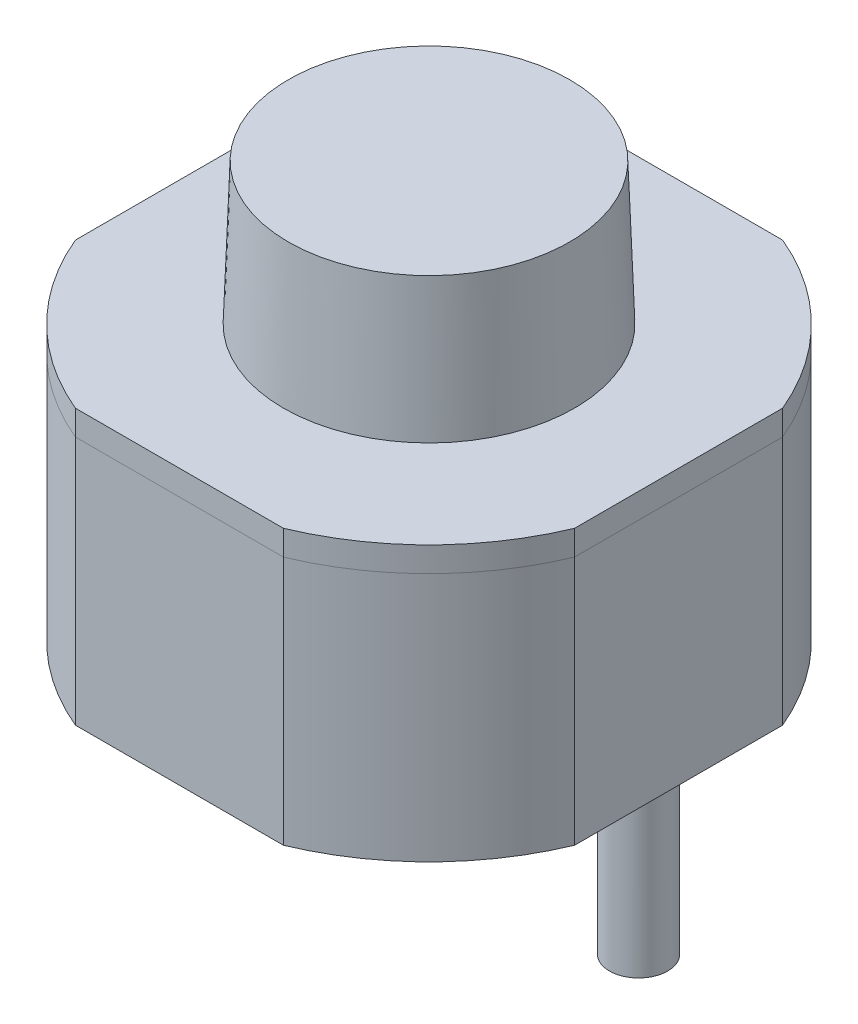
ISO-10303-21;
HEADER;
FILE_DESCRIPTION(('STEP AP214'),'2;1');
FILE_NAME('part.step','',(''),(''),'','','');
FILE_SCHEMA(('AUTOMOTIVE_DESIGN { 1 0 10303 214 1 1 1 1 }'));
ENDSEC;
DATA;
#1=APPLICATION_CONTEXT('core data for automotive mechanical design processes');
#2=APPLICATION_PROTOCOL_DEFINITION('international standard','automotive_design',2000,#1);
#3=PRODUCT_CONTEXT('',#1,'mechanical');
#4=PRODUCT('Part','Part','',(#3));
#5=PRODUCT_RELATED_PRODUCT_CATEGORY('part','',(#4));
#6=PRODUCT_DEFINITION_FORMATION('','',#4);
#7=PRODUCT_DEFINITION_CONTEXT('part definition',#1,'design');
#8=PRODUCT_DEFINITION('design','',#6,#7);
#9=PRODUCT_DEFINITION_SHAPE('','',#8);
#10=(LENGTH_UNIT() NAMED_UNIT(*) SI_UNIT(.MILLI.,.METRE.));
#11=(NAMED_UNIT(*) PLANE_ANGLE_UNIT() SI_UNIT($,.RADIAN.));
#12=(NAMED_UNIT(*) SI_UNIT($,.STERADIAN.) SOLID_ANGLE_UNIT());
#13=UNCERTAINTY_MEASURE_WITH_UNIT(LENGTH_MEASURE(1.E-05),#10,'distance_accuracy_value','');
#14=(GEOMETRIC_REPRESENTATION_CONTEXT(3) GLOBAL_UNCERTAINTY_ASSIGNED_CONTEXT((#13)) GLOBAL_UNIT_ASSIGNED_CONTEXT((#10,
#11,#12)) REPRESENTATION_CONTEXT('',''));
#15=CARTESIAN_POINT('',(0.,0.,0.));
#16=DIRECTION('',(0.,0.,1.));
#17=DIRECTION('',(1.,0.,0.));
#18=AXIS2_PLACEMENT_3D('',#15,#16,#17);
#19=CARTESIAN_POINT('',(0.,3.3,0.));
#20=DIRECTION('',(0.,-1.,0.));
#21=DIRECTION('',(0.,0.,1.));
#22=AXIS2_PLACEMENT_3D('',#19,#20,#21);
#23=CONICAL_SURFACE('',#22,1.75,0.0349065850398866);
#24=CARTESIAN_POINT('',(0.,5.,0.));
#25=DIRECTION('',(0.,1.,0.));
#26=DIRECTION('',(0.,0.,1.));
#27=AXIS2_PLACEMENT_3D('',#24,#25,#26);
#28=CIRCLE('',#27,1.69063469186403);
#29=CARTESIAN_POINT('',(0.,5.,1.69063469186403));
#30=VERTEX_POINT('',#29);
#31=EDGE_CURVE('E12',#30,#30,#28,.T.);
#32=ORIENTED_EDGE('',*,*,#31,.F.);
#33=EDGE_LOOP('',(#32));
#34=FACE_BOUND('',#33,.T.);
#35=CARTESIAN_POINT('',(0.,3.3,0.));
#36=DIRECTION('',(0.,1.,0.));
#37=DIRECTION('',(0.,0.,1.));
#38=AXIS2_PLACEMENT_3D('',#35,#36,#37);
#39=CIRCLE('',#38,1.75);
#40=CARTESIAN_POINT('',(0.,3.3,1.75));
#41=VERTEX_POINT('',#40);
#42=EDGE_CURVE('E66',#41,#41,#39,.T.);
#43=ORIENTED_EDGE('',*,*,#42,.T.);
#44=EDGE_LOOP('',(#43));
#45=FACE_BOUND('',#44,.T.);
#46=ADVANCED_FACE('F59',(#34,#45),#23,.T.);
#47=CARTESIAN_POINT('',(0.,5.,0.));
#48=DIRECTION('',(0.,1.,0.));
#49=DIRECTION('',(0.,0.,1.));
#50=AXIS2_PLACEMENT_3D('',#47,#48,#49);
#51=PLANE('',#50);
#52=ORIENTED_EDGE('',*,*,#31,.T.);
#53=EDGE_LOOP('',(#52));
#54=FACE_BOUND('',#53,.T.);
#55=ADVANCED_FACE('F76',(#54),#51,.T.);
#56=CARTESIAN_POINT('',(0.,3.3,0.));
#57=DIRECTION('',(0.,1.,0.));
#58=DIRECTION('',(0.,0.,1.));
#59=AXIS2_PLACEMENT_3D('',#56,#57,#58);
#60=PLANE('',#59);
#61=ORIENTED_EDGE('',*,*,#42,.F.);
#62=EDGE_LOOP('',(#61));
#63=FACE_BOUND('',#62,.T.);
#64=ADVANCED_FACE('F74',(#63),#60,.F.);
#65=CLOSED_SHELL('',(#46,#55,#64));
#66=MANIFOLD_SOLID_BREP('B2',#65);
#67=CARTESIAN_POINT('',(0.,3.3,0.));
#68=DIRECTION('',(0.,-1.,0.));
#69=DIRECTION('',(0.,0.,-1.));
#70=AXIS2_PLACEMENT_3D('',#67,#68,#69);
#71=CYLINDRICAL_SURFACE('',#70,3.25);
#72=CARTESIAN_POINT('',(0.,3.,0.));
#73=DIRECTION('',(0.,1.,0.));
#74=DIRECTION('',(0.,0.,1.));
#75=AXIS2_PLACEMENT_3D('',#72,#73,#74);
#76=CIRCLE('',#75,3.25);
#77=CARTESIAN_POINT('',(-3.,3.,1.25));
#78=VERTEX_POINT('',#77);
#79=CARTESIAN_POINT('',(-1.25,3.,3.));
#80=VERTEX_POINT('',#79);
#81=EDGE_CURVE('E228',#78,#80,#76,.T.);
#82=ORIENTED_EDGE('',*,*,#81,.T.);
#83=DIRECTION('',(0.,-1.,0.));
#84=VECTOR('',#83,1.);
#85=CARTESIAN_POINT('',(-1.25,3.3,3.));
#86=LINE('',#85,#84);
#87=CARTESIAN_POINT('',(-1.25,3.3,3.));
#88=VERTEX_POINT('',#87);
#89=EDGE_CURVE('E57',#88,#80,#86,.T.);
#90=ORIENTED_EDGE('',*,*,#89,.F.);
#91=CARTESIAN_POINT('',(0.,3.3,0.));
#92=DIRECTION('',(0.,1.,0.));
#93=DIRECTION('',(0.,0.,1.));
#94=AXIS2_PLACEMENT_3D('',#91,#92,#93);
#95=CIRCLE('',#94,3.25);
#96=CARTESIAN_POINT('',(-3.,3.3,1.25));
#97=VERTEX_POINT('',#96);
#98=EDGE_CURVE('E249',#97,#88,#95,.T.);
#99=ORIENTED_EDGE('',*,*,#98,.F.);
#100=DIRECTION('',(0.,-1.,0.));
#101=VECTOR('',#100,1.);
#102=CARTESIAN_POINT('',(-3.,3.3,1.25));
#103=LINE('',#102,#101);
#104=EDGE_CURVE('E224',#97,#78,#103,.T.);
#105=ORIENTED_EDGE('',*,*,#104,.T.);
#106=EDGE_LOOP('',(#82,#90,#99,#105));
#107=FACE_BOUND('',#106,.T.);
#108=ADVANCED_FACE('F126',(#107),#71,.T.);
#109=CARTESIAN_POINT('',(-1.25,3.3,3.));
#110=DIRECTION('',(0.,0.,-1.));
#111=DIRECTION('',(-1.,0.,0.));
#112=AXIS2_PLACEMENT_3D('',#109,#110,#111);
#113=PLANE('',#112);
#114=DIRECTION('',(1.,0.,0.));
#115=VECTOR('',#114,1.);
#116=CARTESIAN_POINT('',(-1.25,3.,3.));
#117=LINE('',#116,#115);
#118=CARTESIAN_POINT('',(1.25,3.,3.));
#119=VERTEX_POINT('',#118);
#120=EDGE_CURVE('E232',#80,#119,#117,.T.);
#121=ORIENTED_EDGE('',*,*,#120,.T.);
#122=DIRECTION('',(0.,-1.,0.));
#123=VECTOR('',#122,1.);
#124=CARTESIAN_POINT('',(1.25,3.3,3.));
#125=LINE('',#124,#123);
#126=CARTESIAN_POINT('',(1.25,3.3,3.));
#127=VERTEX_POINT('',#126);
#128=EDGE_CURVE('E135',#127,#119,#125,.T.);
#129=ORIENTED_EDGE('',*,*,#128,.F.);
#130=DIRECTION('',(1.,0.,0.));
#131=VECTOR('',#130,1.);
#132=CARTESIAN_POINT('',(-1.25,3.3,3.));
#133=LINE('',#132,#131);
#134=EDGE_CURVE('E186',#88,#127,#133,.T.);
#135=ORIENTED_EDGE('',*,*,#134,.F.);
#136=ORIENTED_EDGE('',*,*,#89,.T.);
#137=EDGE_LOOP('',(#121,#129,#135,#136));
#138=FACE_BOUND('',#137,.T.);
#139=ADVANCED_FACE('F295',(#138),#113,.F.);
#140=CARTESIAN_POINT('',(0.,3.3,0.));
#141=DIRECTION('',(0.,-1.,0.));
#142=DIRECTION('',(0.,0.,-1.));
#143=AXIS2_PLACEMENT_3D('',#140,#141,#142);
#144=CYLINDRICAL_SURFACE('',#143,3.25);
#145=CARTESIAN_POINT('',(0.,3.,0.));
#146=DIRECTION('',(0.,1.,0.));
#147=DIRECTION('',(0.,0.,1.));
#148=AXIS2_PLACEMENT_3D('',#145,#146,#147);
#149=CIRCLE('',#148,3.25);
#150=CARTESIAN_POINT('',(3.,3.,1.25));
#151=VERTEX_POINT('',#150);
#152=EDGE_CURVE('E234',#119,#151,#149,.T.);
#153=ORIENTED_EDGE('',*,*,#152,.T.);
#154=DIRECTION('',(0.,-1.,0.));
#155=VECTOR('',#154,1.);
#156=CARTESIAN_POINT('',(3.,3.3,1.25));
#157=LINE('',#156,#155);
#158=CARTESIAN_POINT('',(3.,3.3,1.25));
#159=VERTEX_POINT('',#158);
#160=EDGE_CURVE('E260',#159,#151,#157,.T.);
#161=ORIENTED_EDGE('',*,*,#160,.F.);
#162=CARTESIAN_POINT('',(0.,3.3,0.));
#163=DIRECTION('',(0.,1.,0.));
#164=DIRECTION('',(0.,0.,1.));
#165=AXIS2_PLACEMENT_3D('',#162,#163,#164);
#166=CIRCLE('',#165,3.25);
#167=EDGE_CURVE('E270',#127,#159,#166,.T.);
#168=ORIENTED_EDGE('',*,*,#167,.F.);
#169=ORIENTED_EDGE('',*,*,#128,.T.);
#170=EDGE_LOOP('',(#153,#161,#168,#169));
#171=FACE_BOUND('',#170,.T.);
#172=ADVANCED_FACE('F268',(#171),#144,.T.);
#173=CARTESIAN_POINT('',(3.,3.3,1.25));
#174=DIRECTION('',(-1.,0.,0.));
#175=DIRECTION('',(0.,0.,1.));
#176=AXIS2_PLACEMENT_3D('',#173,#174,#175);
#177=PLANE('',#176);
#178=DIRECTION('',(0.,0.,-1.));
#179=VECTOR('',#178,1.);
#180=CARTESIAN_POINT('',(3.,3.,1.25));
#181=LINE('',#180,#179);
#182=CARTESIAN_POINT('',(3.,3.,-1.25));
#183=VERTEX_POINT('',#182);
#184=EDGE_CURVE('E237',#151,#183,#181,.T.);
#185=ORIENTED_EDGE('',*,*,#184,.T.);
#186=DIRECTION('',(0.,-1.,0.));
#187=VECTOR('',#186,1.);
#188=CARTESIAN_POINT('',(3.,3.3,-1.25));
#189=LINE('',#188,#187);
#190=CARTESIAN_POINT('',(3.,3.3,-1.25));
#191=VERTEX_POINT('',#190);
#192=EDGE_CURVE('E256',#191,#183,#189,.T.);
#193=ORIENTED_EDGE('',*,*,#192,.F.);
#194=DIRECTION('',(0.,0.,-1.));
#195=VECTOR('',#194,1.);
#196=CARTESIAN_POINT('',(3.,3.3,1.25));
#197=LINE('',#196,#195);
#198=EDGE_CURVE('E283',#159,#191,#197,.T.);
#199=ORIENTED_EDGE('',*,*,#198,.F.);
#200=ORIENTED_EDGE('',*,*,#160,.T.);
#201=EDGE_LOOP('',(#185,#193,#199,#200));
#202=FACE_BOUND('',#201,.T.);
#203=ADVANCED_FACE('F278',(#202),#177,.F.);
#204=CARTESIAN_POINT('',(0.,3.3,0.));
#205=DIRECTION('',(0.,-1.,0.));
#206=DIRECTION('',(0.,0.,-1.));
#207=AXIS2_PLACEMENT_3D('',#204,#205,#206);
#208=CYLINDRICAL_SURFACE('',#207,3.25);
#209=CARTESIAN_POINT('',(0.,3.,0.));
#210=DIRECTION('',(0.,1.,0.));
#211=DIRECTION('',(0.,0.,1.));
#212=AXIS2_PLACEMENT_3D('',#209,#210,#211);
#213=CIRCLE('',#212,3.25);
#214=CARTESIAN_POINT('',(1.25,3.,-3.));
#215=VERTEX_POINT('',#214);
#216=EDGE_CURVE('E240',#183,#215,#213,.T.);
#217=ORIENTED_EDGE('',*,*,#216,.T.);
#218=DIRECTION('',(0.,-1.,0.));
#219=VECTOR('',#218,1.);
#220=CARTESIAN_POINT('',(1.25,3.3,-3.));
#221=LINE('',#220,#219);
#222=CARTESIAN_POINT('',(1.25,3.3,-3.));
#223=VERTEX_POINT('',#222);
#224=EDGE_CURVE('E216',#223,#215,#221,.T.);
#225=ORIENTED_EDGE('',*,*,#224,.F.);
#226=CARTESIAN_POINT('',(0.,3.3,0.));
#227=DIRECTION('',(0.,1.,0.));
#228=DIRECTION('',(0.,0.,1.));
#229=AXIS2_PLACEMENT_3D('',#226,#227,#228);
#230=CIRCLE('',#229,3.25);
#231=EDGE_CURVE('E205',#191,#223,#230,.T.);
#232=ORIENTED_EDGE('',*,*,#231,.F.);
#233=ORIENTED_EDGE('',*,*,#192,.T.);
#234=EDGE_LOOP('',(#217,#225,#232,#233));
#235=FACE_BOUND('',#234,.T.);
#236=ADVANCED_FACE('F281',(#235),#208,.T.);
#237=CARTESIAN_POINT('',(1.25,3.3,-3.));
#238=DIRECTION('',(0.,0.,1.));
#239=DIRECTION('',(1.,0.,0.));
#240=AXIS2_PLACEMENT_3D('',#237,#238,#239);
#241=PLANE('',#240);
#242=DIRECTION('',(-1.,0.,0.));
#243=VECTOR('',#242,1.);
#244=CARTESIAN_POINT('',(1.25,3.,-3.));
#245=LINE('',#244,#243);
#246=CARTESIAN_POINT('',(-1.25,3.,-3.));
#247=VERTEX_POINT('',#246);
#248=EDGE_CURVE('E214',#215,#247,#245,.T.);
#249=ORIENTED_EDGE('',*,*,#248,.T.);
#250=DIRECTION('',(0.,-1.,0.));
#251=VECTOR('',#250,1.);
#252=CARTESIAN_POINT('',(-1.25,3.3,-3.));
#253=LINE('',#252,#251);
#254=CARTESIAN_POINT('',(-1.25,3.3,-3.));
#255=VERTEX_POINT('',#254);
#256=EDGE_CURVE('E211',#255,#247,#253,.T.);
#257=ORIENTED_EDGE('',*,*,#256,.F.);
#258=DIRECTION('',(-1.,0.,0.));
#259=VECTOR('',#258,1.);
#260=CARTESIAN_POINT('',(1.25,3.3,-3.));
#261=LINE('',#260,#259);
#262=EDGE_CURVE('E199',#223,#255,#261,.T.);
#263=ORIENTED_EDGE('',*,*,#262,.F.);
#264=ORIENTED_EDGE('',*,*,#224,.T.);
#265=EDGE_LOOP('',(#249,#257,#263,#264));
#266=FACE_BOUND('',#265,.T.);
#267=ADVANCED_FACE('F212',(#266),#241,.F.);
#268=CARTESIAN_POINT('',(0.,3.3,0.));
#269=DIRECTION('',(0.,-1.,0.));
#270=DIRECTION('',(0.,0.,-1.));
#271=AXIS2_PLACEMENT_3D('',#268,#269,#270);
#272=CYLINDRICAL_SURFACE('',#271,3.25);
#273=CARTESIAN_POINT('',(0.,3.,0.));
#274=DIRECTION('',(0.,1.,0.));
#275=DIRECTION('',(0.,0.,1.));
#276=AXIS2_PLACEMENT_3D('',#273,#274,#275);
#277=CIRCLE('',#276,3.25);
#278=CARTESIAN_POINT('',(-3.,3.,-1.25));
#279=VERTEX_POINT('',#278);
#280=EDGE_CURVE('E172',#247,#279,#277,.T.);
#281=ORIENTED_EDGE('',*,*,#280,.T.);
#282=DIRECTION('',(0.,-1.,0.));
#283=VECTOR('',#282,1.);
#284=CARTESIAN_POINT('',(-3.,3.3,-1.25));
#285=LINE('',#284,#283);
#286=CARTESIAN_POINT('',(-3.,3.3,-1.25));
#287=VERTEX_POINT('',#286);
#288=EDGE_CURVE('E217',#287,#279,#285,.T.);
#289=ORIENTED_EDGE('',*,*,#288,.F.);
#290=CARTESIAN_POINT('',(0.,3.3,0.));
#291=DIRECTION('',(0.,1.,0.));
#292=DIRECTION('',(0.,0.,1.));
#293=AXIS2_PLACEMENT_3D('',#290,#291,#292);
#294=CIRCLE('',#293,3.25);
#295=EDGE_CURVE('E203',#255,#287,#294,.T.);
#296=ORIENTED_EDGE('',*,*,#295,.F.);
#297=ORIENTED_EDGE('',*,*,#256,.T.);
#298=EDGE_LOOP('',(#281,#289,#296,#297));
#299=FACE_BOUND('',#298,.T.);
#300=ADVANCED_FACE('F219',(#299),#272,.T.);
#301=CARTESIAN_POINT('',(-3.,3.3,-1.25));
#302=DIRECTION('',(1.,0.,0.));
#303=DIRECTION('',(0.,0.,-1.));
#304=AXIS2_PLACEMENT_3D('',#301,#302,#303);
#305=PLANE('',#304);
#306=DIRECTION('',(0.,0.,1.));
#307=VECTOR('',#306,1.);
#308=CARTESIAN_POINT('',(-3.,3.,-1.25));
#309=LINE('',#308,#307);
#310=EDGE_CURVE('E178',#279,#78,#309,.T.);
#311=ORIENTED_EDGE('',*,*,#310,.T.);
#312=ORIENTED_EDGE('',*,*,#104,.F.);
#313=DIRECTION('',(0.,0.,1.));
#314=VECTOR('',#313,1.);
#315=CARTESIAN_POINT('',(-3.,3.3,-1.25));
#316=LINE('',#315,#314);
#317=EDGE_CURVE('E143',#287,#97,#316,.T.);
#318=ORIENTED_EDGE('',*,*,#317,.F.);
#319=ORIENTED_EDGE('',*,*,#288,.T.);
#320=EDGE_LOOP('',(#311,#312,#318,#319));
#321=FACE_BOUND('',#320,.T.);
#322=ADVANCED_FACE('F311',(#321),#305,.F.);
#323=CARTESIAN_POINT('',(0.,3.3,0.));
#324=DIRECTION('',(0.,1.,0.));
#325=DIRECTION('',(0.,0.,1.));
#326=AXIS2_PLACEMENT_3D('',#323,#324,#325);
#327=PLANE('',#326);
#328=ORIENTED_EDGE('',*,*,#98,.T.);
#329=ORIENTED_EDGE('',*,*,#134,.T.);
#330=ORIENTED_EDGE('',*,*,#167,.T.);
#331=ORIENTED_EDGE('',*,*,#198,.T.);
#332=ORIENTED_EDGE('',*,*,#231,.T.);
#333=ORIENTED_EDGE('',*,*,#262,.T.);
#334=ORIENTED_EDGE('',*,*,#295,.T.);
#335=ORIENTED_EDGE('',*,*,#317,.T.);
#336=EDGE_LOOP('',(#328,#329,#330,#331,#332,#333,#334,#335));
#337=FACE_BOUND('',#336,.T.);
#338=ADVANCED_FACE('F201',(#337),#327,.T.);
#339=CARTESIAN_POINT('',(0.,3.,0.));
#340=DIRECTION('',(0.,1.,0.));
#341=DIRECTION('',(0.,0.,1.));
#342=AXIS2_PLACEMENT_3D('',#339,#340,#341);
#343=PLANE('',#342);
#344=ORIENTED_EDGE('',*,*,#81,.F.);
#345=ORIENTED_EDGE('',*,*,#310,.F.);
#346=ORIENTED_EDGE('',*,*,#280,.F.);
#347=ORIENTED_EDGE('',*,*,#248,.F.);
#348=ORIENTED_EDGE('',*,*,#216,.F.);
#349=ORIENTED_EDGE('',*,*,#184,.F.);
#350=ORIENTED_EDGE('',*,*,#152,.F.);
#351=ORIENTED_EDGE('',*,*,#120,.F.);
#352=EDGE_LOOP('',(#344,#345,#346,#347,#348,#349,#350,#351));
#353=FACE_BOUND('',#352,.T.);
#354=ADVANCED_FACE('F274',(#353),#343,.F.);
#355=CLOSED_SHELL('',(#108,#139,#172,#203,#236,#267,#300,#322,#338,#354));
#356=MANIFOLD_SOLID_BREP('B7',#355);
#357=CARTESIAN_POINT('',(3.,3.,-3.));
#358=DIRECTION('',(-1.,0.,0.));
#359=DIRECTION('',(0.,0.,1.));
#360=AXIS2_PLACEMENT_3D('',#357,#358,#359);
#361=PLANE('',#360);
#362=DIRECTION('',(0.,1.,0.));
#363=VECTOR('',#362,1.);
#364=CARTESIAN_POINT('',(3.,0.,1.25));
#365=LINE('',#364,#363);
#366=CARTESIAN_POINT('',(3.,0.,1.25));
#367=VERTEX_POINT('',#366);
#368=CARTESIAN_POINT('',(3.,3.,1.25));
#369=VERTEX_POINT('',#368);
#370=EDGE_CURVE('E495',#367,#369,#365,.T.);
#371=ORIENTED_EDGE('',*,*,#370,.F.);
#372=DIRECTION('',(0.,0.,-1.));
#373=VECTOR('',#372,1.);
#374=CARTESIAN_POINT('',(3.,0.,-3.));
#375=LINE('',#374,#373);
#376=CARTESIAN_POINT('',(3.,0.,-1.25));
#377=VERTEX_POINT('',#376);
#378=EDGE_CURVE('E510',#367,#377,#375,.T.);
#379=ORIENTED_EDGE('',*,*,#378,.T.);
#380=DIRECTION('',(0.,1.,0.));
#381=VECTOR('',#380,1.);
#382=CARTESIAN_POINT('',(3.,0.,-1.25));
#383=LINE('',#382,#381);
#384=CARTESIAN_POINT('',(3.,3.,-1.25));
#385=VERTEX_POINT('',#384);
#386=EDGE_CURVE('E514',#385,#377,#383,.F.);
#387=ORIENTED_EDGE('',*,*,#386,.F.);
#388=DIRECTION('',(0.,0.,-1.));
#389=VECTOR('',#388,1.);
#390=CARTESIAN_POINT('',(3.,3.,-3.));
#391=LINE('',#390,#389);
#392=EDGE_CURVE('E512',#369,#385,#391,.T.);
#393=ORIENTED_EDGE('',*,*,#392,.F.);
#394=EDGE_LOOP('',(#371,#379,#387,#393));
#395=FACE_BOUND('',#394,.T.);
#396=ADVANCED_FACE('F428',(#395),#361,.F.);
#397=CARTESIAN_POINT('',(-3.,3.,-3.));
#398=DIRECTION('',(0.,0.,1.));
#399=DIRECTION('',(1.,0.,0.));
#400=AXIS2_PLACEMENT_3D('',#397,#398,#399);
#401=PLANE('',#400);
#402=DIRECTION('',(0.,1.,0.));
#403=VECTOR('',#402,1.);
#404=CARTESIAN_POINT('',(1.25,0.,-3.));
#405=LINE('',#404,#403);
#406=CARTESIAN_POINT('',(1.25,0.,-3.));
#407=VERTEX_POINT('',#406);
#408=CARTESIAN_POINT('',(1.25,3.,-3.));
#409=VERTEX_POINT('',#408);
#410=EDGE_CURVE('E587',#407,#409,#405,.T.);
#411=ORIENTED_EDGE('',*,*,#410,.F.);
#412=DIRECTION('',(-1.,0.,0.));
#413=VECTOR('',#412,1.);
#414=CARTESIAN_POINT('',(-3.,0.,-3.));
#415=LINE('',#414,#413);
#416=CARTESIAN_POINT('',(-1.25,0.,-3.));
#417=VERTEX_POINT('',#416);
#418=EDGE_CURVE('E521',#407,#417,#415,.T.);
#419=ORIENTED_EDGE('',*,*,#418,.T.);
#420=DIRECTION('',(0.,1.,0.));
#421=VECTOR('',#420,1.);
#422=CARTESIAN_POINT('',(-1.25,0.,-3.));
#423=LINE('',#422,#421);
#424=CARTESIAN_POINT('',(-1.25,3.,-3.));
#425=VERTEX_POINT('',#424);
#426=EDGE_CURVE('E443',#425,#417,#423,.F.);
#427=ORIENTED_EDGE('',*,*,#426,.F.);
#428=DIRECTION('',(-1.,0.,0.));
#429=VECTOR('',#428,1.);
#430=CARTESIAN_POINT('',(-3.,3.,-3.));
#431=LINE('',#430,#429);
#432=EDGE_CURVE('E592',#409,#425,#431,.T.);
#433=ORIENTED_EDGE('',*,*,#432,.F.);
#434=EDGE_LOOP('',(#411,#419,#427,#433));
#435=FACE_BOUND('',#434,.T.);
#436=ADVANCED_FACE('F618',(#435),#401,.F.);
#437=CARTESIAN_POINT('',(-3.,3.,-3.));
#438=DIRECTION('',(1.,0.,0.));
#439=DIRECTION('',(0.,0.,-1.));
#440=AXIS2_PLACEMENT_3D('',#437,#438,#439);
#441=PLANE('',#440);
#442=DIRECTION('',(0.,1.,0.));
#443=VECTOR('',#442,1.);
#444=CARTESIAN_POINT('',(-3.,0.,-1.25));
#445=LINE('',#444,#443);
#446=CARTESIAN_POINT('',(-3.,0.,-1.25));
#447=VERTEX_POINT('',#446);
#448=CARTESIAN_POINT('',(-3.,3.,-1.25));
#449=VERTEX_POINT('',#448);
#450=EDGE_CURVE('E558',#447,#449,#445,.T.);
#451=ORIENTED_EDGE('',*,*,#450,.F.);
#452=DIRECTION('',(0.,0.,1.));
#453=VECTOR('',#452,1.);
#454=CARTESIAN_POINT('',(-3.,0.,-3.));
#455=LINE('',#454,#453);
#456=CARTESIAN_POINT('',(-3.,0.,1.25));
#457=VERTEX_POINT('',#456);
#458=EDGE_CURVE('E528',#447,#457,#455,.T.);
#459=ORIENTED_EDGE('',*,*,#458,.T.);
#460=DIRECTION('',(0.,1.,0.));
#461=VECTOR('',#460,1.);
#462=CARTESIAN_POINT('',(-3.,0.,1.25));
#463=LINE('',#462,#461);
#464=CARTESIAN_POINT('',(-3.,3.,1.25));
#465=VERTEX_POINT('',#464);
#466=EDGE_CURVE('E451',#465,#457,#463,.F.);
#467=ORIENTED_EDGE('',*,*,#466,.F.);
#468=DIRECTION('',(0.,0.,1.));
#469=VECTOR('',#468,1.);
#470=CARTESIAN_POINT('',(-3.,3.,-3.));
#471=LINE('',#470,#469);
#472=EDGE_CURVE('E565',#449,#465,#471,.T.);
#473=ORIENTED_EDGE('',*,*,#472,.F.);
#474=EDGE_LOOP('',(#451,#459,#467,#473));
#475=FACE_BOUND('',#474,.T.);
#476=ADVANCED_FACE('F563',(#475),#441,.F.);
#477=CARTESIAN_POINT('',(-3.,3.,3.));
#478=DIRECTION('',(0.,0.,-1.));
#479=DIRECTION('',(-1.,0.,0.));
#480=AXIS2_PLACEMENT_3D('',#477,#478,#479);
#481=PLANE('',#480);
#482=DIRECTION('',(0.,1.,0.));
#483=VECTOR('',#482,1.);
#484=CARTESIAN_POINT('',(-1.25,0.,3.));
#485=LINE('',#484,#483);
#486=CARTESIAN_POINT('',(-1.25,0.,3.));
#487=VERTEX_POINT('',#486);
#488=CARTESIAN_POINT('',(-1.25,3.,3.));
#489=VERTEX_POINT('',#488);
#490=EDGE_CURVE('E570',#487,#489,#485,.T.);
#491=ORIENTED_EDGE('',*,*,#490,.F.);
#492=DIRECTION('',(1.,0.,0.));
#493=VECTOR('',#492,1.);
#494=CARTESIAN_POINT('',(-3.,0.,3.));
#495=LINE('',#494,#493);
#496=CARTESIAN_POINT('',(1.25,0.,3.));
#497=VERTEX_POINT('',#496);
#498=EDGE_CURVE('E537',#487,#497,#495,.T.);
#499=ORIENTED_EDGE('',*,*,#498,.T.);
#500=DIRECTION('',(0.,1.,0.));
#501=VECTOR('',#500,1.);
#502=CARTESIAN_POINT('',(1.25,0.,3.));
#503=LINE('',#502,#501);
#504=CARTESIAN_POINT('',(1.25,3.,3.));
#505=VERTEX_POINT('',#504);
#506=EDGE_CURVE('E498',#505,#497,#503,.F.);
#507=ORIENTED_EDGE('',*,*,#506,.F.);
#508=DIRECTION('',(1.,0.,0.));
#509=VECTOR('',#508,1.);
#510=CARTESIAN_POINT('',(-3.,3.,3.));
#511=LINE('',#510,#509);
#512=EDGE_CURVE('E531',#489,#505,#511,.T.);
#513=ORIENTED_EDGE('',*,*,#512,.F.);
#514=EDGE_LOOP('',(#491,#499,#507,#513));
#515=FACE_BOUND('',#514,.T.);
#516=ADVANCED_FACE('F574',(#515),#481,.F.);
#517=CARTESIAN_POINT('',(0.,3.,0.));
#518=DIRECTION('',(0.,1.,0.));
#519=DIRECTION('',(0.,0.,1.));
#520=AXIS2_PLACEMENT_3D('',#517,#518,#519);
#521=PLANE('',#520);
#522=ORIENTED_EDGE('',*,*,#512,.T.);
#523=CARTESIAN_POINT('',(0.,3.,0.));
#524=DIRECTION('',(0.,1.,0.));
#525=DIRECTION('',(0.,0.,1.));
#526=AXIS2_PLACEMENT_3D('',#523,#524,#525);
#527=CIRCLE('',#526,3.25);
#528=EDGE_CURVE('E504',#505,#369,#527,.T.);
#529=ORIENTED_EDGE('',*,*,#528,.T.);
#530=ORIENTED_EDGE('',*,*,#392,.T.);
#531=EDGE_CURVE('E606',#385,#409,#527,.T.);
#532=ORIENTED_EDGE('',*,*,#531,.T.);
#533=ORIENTED_EDGE('',*,*,#432,.T.);
#534=EDGE_CURVE('E602',#425,#449,#527,.T.);
#535=ORIENTED_EDGE('',*,*,#534,.T.);
#536=ORIENTED_EDGE('',*,*,#472,.T.);
#537=EDGE_CURVE('E600',#465,#489,#527,.T.);
#538=ORIENTED_EDGE('',*,*,#537,.T.);
#539=EDGE_LOOP('',(#522,#529,#530,#532,#533,#535,#536,#538));
#540=FACE_BOUND('',#539,.T.);
#541=ADVANCED_FACE('F599',(#540),#521,.T.);
#542=CARTESIAN_POINT('',(0.,0.,0.));
#543=DIRECTION('',(0.,1.,0.));
#544=DIRECTION('',(0.,0.,1.));
#545=AXIS2_PLACEMENT_3D('',#542,#543,#544);
#546=PLANE('',#545);
#547=CARTESIAN_POINT('',(2.51893975535752,0.,0.));
#548=DIRECTION('',(0.,1.,0.));
#549=DIRECTION('',(0.,0.,1.));
#550=AXIS2_PLACEMENT_3D('',#547,#548,#549);
#551=CIRCLE('',#550,0.35);
#552=CARTESIAN_POINT('',(2.51893975535752,0.,0.35));
#553=VERTEX_POINT('',#552);
#554=EDGE_CURVE('E124',#553,#553,#551,.F.);
#555=ORIENTED_EDGE('',*,*,#554,.F.);
#556=EDGE_LOOP('',(#555));
#557=FACE_BOUND('',#556,.T.);
#558=CARTESIAN_POINT('',(-2.51893975535752,0.,0.));
#559=DIRECTION('',(0.,1.,0.));
#560=DIRECTION('',(0.,0.,1.));
#561=AXIS2_PLACEMENT_3D('',#558,#559,#560);
#562=CIRCLE('',#561,0.35);
#563=CARTESIAN_POINT('',(-2.51893975535752,0.,0.35));
#564=VERTEX_POINT('',#563);
#565=EDGE_CURVE('E436',#564,#564,#562,.F.);
#566=ORIENTED_EDGE('',*,*,#565,.F.);
#567=EDGE_LOOP('',(#566));
#568=FACE_BOUND('',#567,.T.);
#569=CARTESIAN_POINT('',(0.,0.,0.));
#570=DIRECTION('',(0.,1.,0.));
#571=DIRECTION('',(0.,0.,1.));
#572=AXIS2_PLACEMENT_3D('',#569,#570,#571);
#573=CIRCLE('',#572,3.25);
#574=EDGE_CURVE('E492',#497,#367,#573,.T.);
#575=ORIENTED_EDGE('',*,*,#574,.F.);
#576=ORIENTED_EDGE('',*,*,#498,.F.);
#577=CARTESIAN_POINT('',(0.,0.,0.));
#578=DIRECTION('',(0.,1.,0.));
#579=DIRECTION('',(0.,0.,1.));
#580=AXIS2_PLACEMENT_3D('',#577,#578,#579);
#581=CIRCLE('',#580,3.25);
#582=EDGE_CURVE('E539',#457,#487,#581,.T.);
#583=ORIENTED_EDGE('',*,*,#582,.F.);
#584=ORIENTED_EDGE('',*,*,#458,.F.);
#585=EDGE_CURVE('E541',#417,#447,#581,.T.);
#586=ORIENTED_EDGE('',*,*,#585,.F.);
#587=ORIENTED_EDGE('',*,*,#418,.F.);
#588=EDGE_CURVE('E519',#377,#407,#581,.T.);
#589=ORIENTED_EDGE('',*,*,#588,.F.);
#590=ORIENTED_EDGE('',*,*,#378,.F.);
#591=EDGE_LOOP('',(#575,#576,#583,#584,#586,#587,#589,#590));
#592=FACE_BOUND('',#591,.T.);
#593=ADVANCED_FACE('F517',(#557,#568,#592),#546,.F.);
#594=CARTESIAN_POINT('',(0.,0.,0.));
#595=DIRECTION('',(0.,1.,0.));
#596=DIRECTION('',(0.,0.,1.));
#597=AXIS2_PLACEMENT_3D('',#594,#595,#596);
#598=CYLINDRICAL_SURFACE('',#597,3.25);
#599=ORIENTED_EDGE('',*,*,#466,.T.);
#600=ORIENTED_EDGE('',*,*,#582,.T.);
#601=ORIENTED_EDGE('',*,*,#490,.T.);
#602=ORIENTED_EDGE('',*,*,#537,.F.);
#603=EDGE_LOOP('',(#599,#600,#601,#602));
#604=FACE_BOUND('',#603,.T.);
#605=ADVANCED_FACE('F569',(#604),#598,.T.);
#606=ORIENTED_EDGE('',*,*,#426,.T.);
#607=ORIENTED_EDGE('',*,*,#585,.T.);
#608=ORIENTED_EDGE('',*,*,#450,.T.);
#609=ORIENTED_EDGE('',*,*,#534,.F.);
#610=EDGE_LOOP('',(#606,#607,#608,#609));
#611=FACE_BOUND('',#610,.T.);
#612=ADVANCED_FACE('F557',(#611),#598,.T.);
#613=ORIENTED_EDGE('',*,*,#386,.T.);
#614=ORIENTED_EDGE('',*,*,#588,.T.);
#615=ORIENTED_EDGE('',*,*,#410,.T.);
#616=ORIENTED_EDGE('',*,*,#531,.F.);
#617=EDGE_LOOP('',(#613,#614,#615,#616));
#618=FACE_BOUND('',#617,.T.);
#619=ADVANCED_FACE('F619',(#618),#598,.T.);
#620=ORIENTED_EDGE('',*,*,#370,.T.);
#621=ORIENTED_EDGE('',*,*,#528,.F.);
#622=ORIENTED_EDGE('',*,*,#506,.T.);
#623=ORIENTED_EDGE('',*,*,#574,.T.);
#624=EDGE_LOOP('',(#620,#621,#622,#623));
#625=FACE_BOUND('',#624,.T.);
#626=ADVANCED_FACE('F494',(#625),#598,.T.);
#627=CARTESIAN_POINT('',(-2.51893975535752,-2.,0.));
#628=DIRECTION('',(0.,1.,0.));
#629=DIRECTION('',(0.,0.,1.));
#630=AXIS2_PLACEMENT_3D('',#627,#628,#629);
#631=CYLINDRICAL_SURFACE('',#630,0.35);
#632=CARTESIAN_POINT('',(-2.51893975535752,-2.,0.));
#633=DIRECTION('',(0.,-1.,0.));
#634=DIRECTION('',(0.,0.,-1.));
#635=AXIS2_PLACEMENT_3D('',#632,#633,#634);
#636=CIRCLE('',#635,0.35);
#637=CARTESIAN_POINT('',(-2.51893975535752,-2.,-0.35));
#638=VERTEX_POINT('',#637);
#639=EDGE_CURVE('E603',#638,#638,#636,.T.);
#640=ORIENTED_EDGE('',*,*,#639,.F.);
#641=EDGE_LOOP('',(#640));
#642=FACE_BOUND('',#641,.T.);
#643=ORIENTED_EDGE('',*,*,#565,.T.);
#644=EDGE_LOOP('',(#643));
#645=FACE_BOUND('',#644,.T.);
#646=ADVANCED_FACE('F626',(#642,#645),#631,.T.);
#647=CARTESIAN_POINT('',(-2.51893975535752,-2.,0.));
#648=DIRECTION('',(0.,-1.,0.));
#649=DIRECTION('',(0.,0.,-1.));
#650=AXIS2_PLACEMENT_3D('',#647,#648,#649);
#651=PLANE('',#650);
#652=ORIENTED_EDGE('',*,*,#639,.T.);
#653=EDGE_LOOP('',(#652));
#654=FACE_BOUND('',#653,.T.);
#655=ADVANCED_FACE('F669',(#654),#651,.T.);
#656=CARTESIAN_POINT('',(2.51893975535752,-2.,0.));
#657=DIRECTION('',(0.,1.,0.));
#658=DIRECTION('',(0.,0.,1.));
#659=AXIS2_PLACEMENT_3D('',#656,#657,#658);
#660=CYLINDRICAL_SURFACE('',#659,0.35);
#661=CARTESIAN_POINT('',(2.51893975535752,-2.,0.));
#662=DIRECTION('',(0.,-1.,0.));
#663=DIRECTION('',(0.,0.,-1.));
#664=AXIS2_PLACEMENT_3D('',#661,#662,#663);
#665=CIRCLE('',#664,0.35);
#666=CARTESIAN_POINT('',(2.51893975535752,-2.,-0.35));
#667=VERTEX_POINT('',#666);
#668=EDGE_CURVE('E609',#667,#667,#665,.T.);
#669=ORIENTED_EDGE('',*,*,#668,.F.);
#670=EDGE_LOOP('',(#669));
#671=FACE_BOUND('',#670,.T.);
#672=ORIENTED_EDGE('',*,*,#554,.T.);
#673=EDGE_LOOP('',(#672));
#674=FACE_BOUND('',#673,.T.);
#675=ADVANCED_FACE('F676',(#671,#674),#660,.T.);
#676=CARTESIAN_POINT('',(2.51893975535752,-2.,0.));
#677=DIRECTION('',(0.,-1.,0.));
#678=DIRECTION('',(0.,0.,-1.));
#679=AXIS2_PLACEMENT_3D('',#676,#677,#678);
#680=PLANE('',#679);
#681=ORIENTED_EDGE('',*,*,#668,.T.);
#682=EDGE_LOOP('',(#681));
#683=FACE_BOUND('',#682,.T.);
#684=ADVANCED_FACE('F684',(#683),#680,.T.);
#685=CLOSED_SHELL('',(#396,#436,#476,#516,#541,#593,#605,#612,#619,#626,#646,#655,#675,#684));
#686=MANIFOLD_SOLID_BREP('B51',#685);
#687=ADVANCED_BREP_SHAPE_REPRESENTATION('',(#18,#66,#356,#686),#14);
#688=SHAPE_DEFINITION_REPRESENTATION(#9,#687);
ENDSEC;
END-ISO-10303-21;
